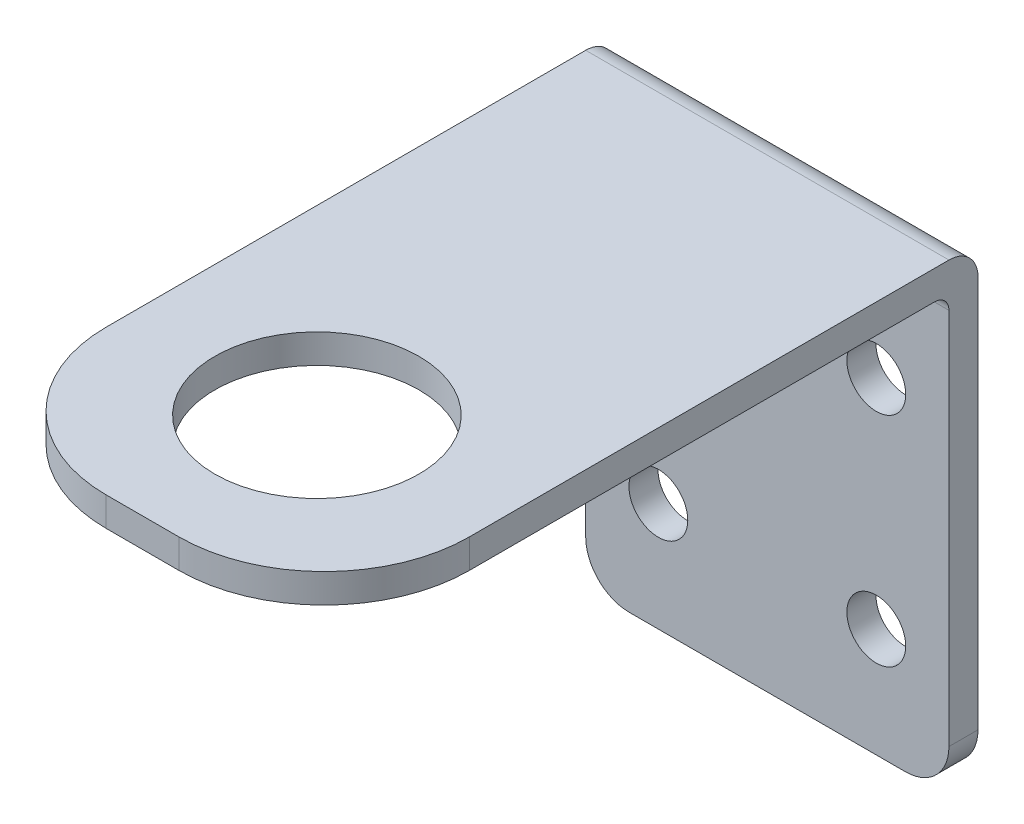
ISO-10303-21;
HEADER;
FILE_DESCRIPTION(('STEP AP214'),'2;1');
FILE_NAME('part.step','',(''),(''),'','','');
FILE_SCHEMA(('AUTOMOTIVE_DESIGN { 1 0 10303 214 1 1 1 1 }'));
ENDSEC;
DATA;
#1=APPLICATION_CONTEXT('core data for automotive mechanical design processes');
#2=APPLICATION_PROTOCOL_DEFINITION('international standard','automotive_design',2000,#1);
#3=PRODUCT_CONTEXT('',#1,'mechanical');
#4=PRODUCT('Part','Part','',(#3));
#5=PRODUCT_RELATED_PRODUCT_CATEGORY('part','',(#4));
#6=PRODUCT_DEFINITION_FORMATION('','',#4);
#7=PRODUCT_DEFINITION_CONTEXT('part definition',#1,'design');
#8=PRODUCT_DEFINITION('design','',#6,#7);
#9=PRODUCT_DEFINITION_SHAPE('','',#8);
#10=(LENGTH_UNIT() NAMED_UNIT(*) SI_UNIT(.MILLI.,.METRE.));
#11=(NAMED_UNIT(*) PLANE_ANGLE_UNIT() SI_UNIT($,.RADIAN.));
#12=(NAMED_UNIT(*) SI_UNIT($,.STERADIAN.) SOLID_ANGLE_UNIT());
#13=UNCERTAINTY_MEASURE_WITH_UNIT(LENGTH_MEASURE(1.E-05),#10,'distance_accuracy_value','');
#14=(GEOMETRIC_REPRESENTATION_CONTEXT(3) GLOBAL_UNCERTAINTY_ASSIGNED_CONTEXT((#13)) GLOBAL_UNIT_ASSIGNED_CONTEXT((#10,
#11,#12)) REPRESENTATION_CONTEXT('',''));
#15=CARTESIAN_POINT('',(0.,0.,0.));
#16=DIRECTION('',(0.,0.,1.));
#17=DIRECTION('',(1.,0.,0.));
#18=AXIS2_PLACEMENT_3D('',#15,#16,#17);
#19=CARTESIAN_POINT('',(12.5,15.,2.));
#20=DIRECTION('',(-1.,0.,0.));
#21=DIRECTION('',(0.,-1.,0.));
#22=AXIS2_PLACEMENT_3D('',#19,#20,#21);
#23=PLANE('',#22);
#24=DIRECTION('',(0.,1.,0.));
#25=VECTOR('',#24,1.);
#26=CARTESIAN_POINT('',(12.5,15.,2.));
#27=LINE('',#26,#25);
#28=CARTESIAN_POINT('',(12.5,-12.,2.));
#29=VERTEX_POINT('',#28);
#30=CARTESIAN_POINT('',(12.5,14.,2.));
#31=VERTEX_POINT('',#30);
#32=EDGE_CURVE('E243',#29,#31,#27,.T.);
#33=ORIENTED_EDGE('',*,*,#32,.F.);
#34=DIRECTION('',(0.,0.,-1.));
#35=VECTOR('',#34,1.);
#36=CARTESIAN_POINT('',(12.5,-12.,2.));
#37=LINE('',#36,#35);
#38=CARTESIAN_POINT('',(12.5,-12.,0.));
#39=VERTEX_POINT('',#38);
#40=EDGE_CURVE('E11',#29,#39,#37,.T.);
#41=ORIENTED_EDGE('',*,*,#40,.T.);
#42=DIRECTION('',(0.,1.,0.));
#43=VECTOR('',#42,1.);
#44=CARTESIAN_POINT('',(12.5,15.,0.));
#45=LINE('',#44,#43);
#46=CARTESIAN_POINT('',(12.5,15.,0.));
#47=VERTEX_POINT('',#46);
#48=EDGE_CURVE('E132',#39,#47,#45,.T.);
#49=ORIENTED_EDGE('',*,*,#48,.T.);
#50=CARTESIAN_POINT('',(12.5,15.,2.));
#51=DIRECTION('',(-1.,0.,0.));
#52=DIRECTION('',(0.,-1.,0.));
#53=AXIS2_PLACEMENT_3D('',#50,#51,#52);
#54=CIRCLE('',#53,2.);
#55=CARTESIAN_POINT('',(12.5,17.,2.00000000000002));
#56=VERTEX_POINT('',#55);
#57=EDGE_CURVE('E135',#47,#56,#54,.F.);
#58=ORIENTED_EDGE('',*,*,#57,.T.);
#59=DIRECTION('',(0.,0.,-1.));
#60=VECTOR('',#59,1.);
#61=CARTESIAN_POINT('',(12.5,17.,45.));
#62=LINE('',#61,#60);
#63=CARTESIAN_POINT('',(12.5,17.,35.));
#64=VERTEX_POINT('',#63);
#65=EDGE_CURVE('E288',#64,#56,#62,.T.);
#66=ORIENTED_EDGE('',*,*,#65,.F.);
#67=DIRECTION('',(0.,-1.,0.));
#68=VECTOR('',#67,1.);
#69=CARTESIAN_POINT('',(12.5,15.,35.));
#70=LINE('',#69,#68);
#71=CARTESIAN_POINT('',(12.5,15.,35.));
#72=VERTEX_POINT('',#71);
#73=EDGE_CURVE('E187',#64,#72,#70,.T.);
#74=ORIENTED_EDGE('',*,*,#73,.T.);
#75=DIRECTION('',(0.,0.,-1.));
#76=VECTOR('',#75,1.);
#77=CARTESIAN_POINT('',(12.5,15.,45.));
#78=LINE('',#77,#76);
#79=CARTESIAN_POINT('',(12.5,15.,3.00000000000002));
#80=VERTEX_POINT('',#79);
#81=EDGE_CURVE('E262',#72,#80,#78,.T.);
#82=ORIENTED_EDGE('',*,*,#81,.T.);
#83=CARTESIAN_POINT('',(12.5,14.,3.));
#84=DIRECTION('',(-1.,0.,0.));
#85=DIRECTION('',(0.,-1.,0.));
#86=AXIS2_PLACEMENT_3D('',#83,#84,#85);
#87=CIRCLE('',#86,1.);
#88=EDGE_CURVE('E183',#80,#31,#87,.T.);
#89=ORIENTED_EDGE('',*,*,#88,.T.);
#90=EDGE_LOOP('',(#33,#41,#49,#58,#66,#74,#82,#89));
#91=FACE_BOUND('',#90,.T.);
#92=ADVANCED_FACE('F39',(#91),#23,.F.);
#93=CARTESIAN_POINT('',(-12.5,15.,2.));
#94=DIRECTION('',(1.,0.,0.));
#95=DIRECTION('',(0.,1.,0.));
#96=AXIS2_PLACEMENT_3D('',#93,#94,#95);
#97=PLANE('',#96);
#98=DIRECTION('',(0.,-1.,0.));
#99=VECTOR('',#98,1.);
#100=CARTESIAN_POINT('',(-12.5,15.,0.));
#101=LINE('',#100,#99);
#102=CARTESIAN_POINT('',(-12.5,15.,0.));
#103=VERTEX_POINT('',#102);
#104=CARTESIAN_POINT('',(-12.5,-12.,0.));
#105=VERTEX_POINT('',#104);
#106=EDGE_CURVE('E141',#103,#105,#101,.T.);
#107=ORIENTED_EDGE('',*,*,#106,.T.);
#108=DIRECTION('',(0.,0.,-1.));
#109=VECTOR('',#108,1.);
#110=CARTESIAN_POINT('',(-12.5,-12.,2.));
#111=LINE('',#110,#109);
#112=CARTESIAN_POINT('',(-12.5,-12.,2.));
#113=VERTEX_POINT('',#112);
#114=EDGE_CURVE('E63',#105,#113,#111,.F.);
#115=ORIENTED_EDGE('',*,*,#114,.T.);
#116=DIRECTION('',(0.,-1.,0.));
#117=VECTOR('',#116,1.);
#118=CARTESIAN_POINT('',(-12.5,15.,2.));
#119=LINE('',#118,#117);
#120=CARTESIAN_POINT('',(-12.5,14.,2.));
#121=VERTEX_POINT('',#120);
#122=EDGE_CURVE('E160',#121,#113,#119,.T.);
#123=ORIENTED_EDGE('',*,*,#122,.F.);
#124=CARTESIAN_POINT('',(-12.5,14.,3.));
#125=DIRECTION('',(1.,0.,0.));
#126=DIRECTION('',(0.,1.,0.));
#127=AXIS2_PLACEMENT_3D('',#124,#125,#126);
#128=CIRCLE('',#127,1.);
#129=CARTESIAN_POINT('',(-12.5,15.,3.00000000000002));
#130=VERTEX_POINT('',#129);
#131=EDGE_CURVE('E179',#121,#130,#128,.T.);
#132=ORIENTED_EDGE('',*,*,#131,.T.);
#133=DIRECTION('',(0.,0.,-1.));
#134=VECTOR('',#133,1.);
#135=CARTESIAN_POINT('',(-12.5,15.,45.));
#136=LINE('',#135,#134);
#137=CARTESIAN_POINT('',(-12.5,15.,35.));
#138=VERTEX_POINT('',#137);
#139=EDGE_CURVE('E281',#138,#130,#136,.T.);
#140=ORIENTED_EDGE('',*,*,#139,.F.);
#141=DIRECTION('',(0.,1.,0.));
#142=VECTOR('',#141,1.);
#143=CARTESIAN_POINT('',(-12.5,17.,35.));
#144=LINE('',#143,#142);
#145=CARTESIAN_POINT('',(-12.5,17.,35.));
#146=VERTEX_POINT('',#145);
#147=EDGE_CURVE('E209',#138,#146,#144,.T.);
#148=ORIENTED_EDGE('',*,*,#147,.T.);
#149=DIRECTION('',(0.,0.,-1.));
#150=VECTOR('',#149,1.);
#151=CARTESIAN_POINT('',(-12.5,17.,45.));
#152=LINE('',#151,#150);
#153=CARTESIAN_POINT('',(-12.5,17.,2.00000000000002));
#154=VERTEX_POINT('',#153);
#155=EDGE_CURVE('E284',#146,#154,#152,.T.);
#156=ORIENTED_EDGE('',*,*,#155,.T.);
#157=CARTESIAN_POINT('',(-12.5,15.,2.));
#158=DIRECTION('',(1.,0.,0.));
#159=DIRECTION('',(0.,1.,0.));
#160=AXIS2_PLACEMENT_3D('',#157,#158,#159);
#161=CIRCLE('',#160,2.);
#162=EDGE_CURVE('E168',#154,#103,#161,.F.);
#163=ORIENTED_EDGE('',*,*,#162,.T.);
#164=EDGE_LOOP('',(#107,#115,#123,#132,#140,#148,#156,#163));
#165=FACE_BOUND('',#164,.T.);
#166=ADVANCED_FACE('F240',(#165),#97,.F.);
#167=CARTESIAN_POINT('',(-12.5,-15.,2.));
#168=DIRECTION('',(0.,1.,0.));
#169=DIRECTION('',(0.,0.,1.));
#170=AXIS2_PLACEMENT_3D('',#167,#168,#169);
#171=PLANE('',#170);
#172=DIRECTION('',(1.,0.,0.));
#173=VECTOR('',#172,1.);
#174=CARTESIAN_POINT('',(-12.5,-15.,2.));
#175=LINE('',#174,#173);
#176=CARTESIAN_POINT('',(-9.5,-15.,2.));
#177=VERTEX_POINT('',#176);
#178=CARTESIAN_POINT('',(9.5,-15.,2.));
#179=VERTEX_POINT('',#178);
#180=EDGE_CURVE('E157',#177,#179,#175,.T.);
#181=ORIENTED_EDGE('',*,*,#180,.F.);
#182=DIRECTION('',(0.,0.,-1.));
#183=VECTOR('',#182,1.);
#184=CARTESIAN_POINT('',(-9.5,-15.,2.));
#185=LINE('',#184,#183);
#186=CARTESIAN_POINT('',(-9.5,-15.,0.));
#187=VERTEX_POINT('',#186);
#188=EDGE_CURVE('E216',#177,#187,#185,.T.);
#189=ORIENTED_EDGE('',*,*,#188,.T.);
#190=DIRECTION('',(1.,0.,0.));
#191=VECTOR('',#190,1.);
#192=CARTESIAN_POINT('',(-12.5,-15.,0.));
#193=LINE('',#192,#191);
#194=CARTESIAN_POINT('',(9.5,-15.,0.));
#195=VERTEX_POINT('',#194);
#196=EDGE_CURVE('E163',#187,#195,#193,.T.);
#197=ORIENTED_EDGE('',*,*,#196,.T.);
#198=DIRECTION('',(0.,0.,-1.));
#199=VECTOR('',#198,1.);
#200=CARTESIAN_POINT('',(9.5,-15.,2.));
#201=LINE('',#200,#199);
#202=EDGE_CURVE('E213',#195,#179,#201,.F.);
#203=ORIENTED_EDGE('',*,*,#202,.T.);
#204=EDGE_LOOP('',(#181,#189,#197,#203));
#205=FACE_BOUND('',#204,.T.);
#206=ADVANCED_FACE('F236',(#205),#171,.F.);
#207=CARTESIAN_POINT('',(0.,0.,2.));
#208=DIRECTION('',(0.,0.,1.));
#209=DIRECTION('',(1.,0.,0.));
#210=AXIS2_PLACEMENT_3D('',#207,#208,#209);
#211=PLANE('',#210);
#212=CARTESIAN_POINT('',(-7.5,-7.5,2.));
#213=DIRECTION('',(0.,0.,1.));
#214=DIRECTION('',(1.,0.,0.));
#215=AXIS2_PLACEMENT_3D('',#212,#213,#214);
#216=CIRCLE('',#215,2.025);
#217=CARTESIAN_POINT('',(-5.475,-7.5,2.));
#218=VERTEX_POINT('',#217);
#219=EDGE_CURVE('E257',#218,#218,#216,.T.);
#220=ORIENTED_EDGE('',*,*,#219,.F.);
#221=EDGE_LOOP('',(#220));
#222=FACE_BOUND('',#221,.T.);
#223=CARTESIAN_POINT('',(7.5,-7.5,2.));
#224=DIRECTION('',(0.,0.,1.));
#225=DIRECTION('',(1.,0.,0.));
#226=AXIS2_PLACEMENT_3D('',#223,#224,#225);
#227=CIRCLE('',#226,2.025);
#228=CARTESIAN_POINT('',(9.52500000000001,-7.5,2.));
#229=VERTEX_POINT('',#228);
#230=EDGE_CURVE('E266',#229,#229,#227,.T.);
#231=ORIENTED_EDGE('',*,*,#230,.F.);
#232=EDGE_LOOP('',(#231));
#233=FACE_BOUND('',#232,.T.);
#234=CARTESIAN_POINT('',(7.5,7.5,2.));
#235=DIRECTION('',(0.,0.,1.));
#236=DIRECTION('',(1.,0.,0.));
#237=AXIS2_PLACEMENT_3D('',#234,#235,#236);
#238=CIRCLE('',#237,2.025);
#239=CARTESIAN_POINT('',(9.525,7.5,2.));
#240=VERTEX_POINT('',#239);
#241=EDGE_CURVE('E274',#240,#240,#238,.T.);
#242=ORIENTED_EDGE('',*,*,#241,.F.);
#243=EDGE_LOOP('',(#242));
#244=FACE_BOUND('',#243,.T.);
#245=CARTESIAN_POINT('',(-7.5,7.5,2.));
#246=DIRECTION('',(0.,0.,1.));
#247=DIRECTION('',(1.,0.,0.));
#248=AXIS2_PLACEMENT_3D('',#245,#246,#247);
#249=CIRCLE('',#248,2.025);
#250=CARTESIAN_POINT('',(-5.475,7.5,2.));
#251=VERTEX_POINT('',#250);
#252=EDGE_CURVE('E249',#251,#251,#249,.T.);
#253=ORIENTED_EDGE('',*,*,#252,.F.);
#254=EDGE_LOOP('',(#253));
#255=FACE_BOUND('',#254,.T.);
#256=ORIENTED_EDGE('',*,*,#122,.T.);
#257=CARTESIAN_POINT('',(-9.5,-12.,2.));
#258=DIRECTION('',(0.,0.,1.));
#259=DIRECTION('',(1.,0.,0.));
#260=AXIS2_PLACEMENT_3D('',#257,#258,#259);
#261=CIRCLE('',#260,3.);
#262=EDGE_CURVE('E48',#113,#177,#261,.T.);
#263=ORIENTED_EDGE('',*,*,#262,.T.);
#264=ORIENTED_EDGE('',*,*,#180,.T.);
#265=CARTESIAN_POINT('',(9.5,-12.,2.));
#266=DIRECTION('',(0.,0.,1.));
#267=DIRECTION('',(1.,0.,0.));
#268=AXIS2_PLACEMENT_3D('',#265,#266,#267);
#269=CIRCLE('',#268,3.);
#270=EDGE_CURVE('E55',#179,#29,#269,.T.);
#271=ORIENTED_EDGE('',*,*,#270,.T.);
#272=ORIENTED_EDGE('',*,*,#32,.T.);
#273=DIRECTION('',(-1.,0.,0.));
#274=VECTOR('',#273,1.);
#275=CARTESIAN_POINT('',(-12.5,14.,2.));
#276=LINE('',#275,#274);
#277=EDGE_CURVE('E171',#31,#121,#276,.T.);
#278=ORIENTED_EDGE('',*,*,#277,.T.);
#279=EDGE_LOOP('',(#256,#263,#264,#271,#272,#278));
#280=FACE_BOUND('',#279,.T.);
#281=ADVANCED_FACE('F232',(#222,#233,#244,#255,#280),#211,.T.);
#282=CARTESIAN_POINT('',(0.,0.,0.));
#283=DIRECTION('',(0.,0.,1.));
#284=DIRECTION('',(1.,0.,0.));
#285=AXIS2_PLACEMENT_3D('',#282,#283,#284);
#286=PLANE('',#285);
#287=CARTESIAN_POINT('',(-7.5,-7.5,0.));
#288=DIRECTION('',(0.,0.,1.));
#289=DIRECTION('',(1.,0.,0.));
#290=AXIS2_PLACEMENT_3D('',#287,#288,#289);
#291=CIRCLE('',#290,2.025);
#292=CARTESIAN_POINT('',(-5.475,-7.5,0.));
#293=VERTEX_POINT('',#292);
#294=EDGE_CURVE('E261',#293,#293,#291,.T.);
#295=ORIENTED_EDGE('',*,*,#294,.T.);
#296=EDGE_LOOP('',(#295));
#297=FACE_BOUND('',#296,.T.);
#298=CARTESIAN_POINT('',(7.5,-7.5,0.));
#299=DIRECTION('',(0.,0.,1.));
#300=DIRECTION('',(1.,0.,0.));
#301=AXIS2_PLACEMENT_3D('',#298,#299,#300);
#302=CIRCLE('',#301,2.025);
#303=CARTESIAN_POINT('',(9.52500000000001,-7.5,0.));
#304=VERTEX_POINT('',#303);
#305=EDGE_CURVE('E270',#304,#304,#302,.T.);
#306=ORIENTED_EDGE('',*,*,#305,.T.);
#307=EDGE_LOOP('',(#306));
#308=FACE_BOUND('',#307,.T.);
#309=CARTESIAN_POINT('',(7.5,7.5,0.));
#310=DIRECTION('',(0.,0.,1.));
#311=DIRECTION('',(1.,0.,0.));
#312=AXIS2_PLACEMENT_3D('',#309,#310,#311);
#313=CIRCLE('',#312,2.025);
#314=CARTESIAN_POINT('',(9.525,7.5,0.));
#315=VERTEX_POINT('',#314);
#316=EDGE_CURVE('E253',#315,#315,#313,.T.);
#317=ORIENTED_EDGE('',*,*,#316,.T.);
#318=EDGE_LOOP('',(#317));
#319=FACE_BOUND('',#318,.T.);
#320=CARTESIAN_POINT('',(-7.5,7.5,0.));
#321=DIRECTION('',(0.,0.,1.));
#322=DIRECTION('',(1.,0.,0.));
#323=AXIS2_PLACEMENT_3D('',#320,#321,#322);
#324=CIRCLE('',#323,2.025);
#325=CARTESIAN_POINT('',(-5.475,7.5,0.));
#326=VERTEX_POINT('',#325);
#327=EDGE_CURVE('E142',#326,#326,#324,.T.);
#328=ORIENTED_EDGE('',*,*,#327,.T.);
#329=EDGE_LOOP('',(#328));
#330=FACE_BOUND('',#329,.T.);
#331=ORIENTED_EDGE('',*,*,#196,.F.);
#332=CARTESIAN_POINT('',(-9.5,-12.,0.));
#333=DIRECTION('',(0.,0.,1.));
#334=DIRECTION('',(1.,0.,0.));
#335=AXIS2_PLACEMENT_3D('',#332,#333,#334);
#336=CIRCLE('',#335,3.);
#337=EDGE_CURVE('E223',#187,#105,#336,.F.);
#338=ORIENTED_EDGE('',*,*,#337,.T.);
#339=ORIENTED_EDGE('',*,*,#106,.F.);
#340=DIRECTION('',(1.,0.,0.));
#341=VECTOR('',#340,1.);
#342=CARTESIAN_POINT('',(12.5,15.,0.));
#343=LINE('',#342,#341);
#344=EDGE_CURVE('E148',#103,#47,#343,.T.);
#345=ORIENTED_EDGE('',*,*,#344,.T.);
#346=ORIENTED_EDGE('',*,*,#48,.F.);
#347=CARTESIAN_POINT('',(9.5,-12.,0.));
#348=DIRECTION('',(0.,0.,1.));
#349=DIRECTION('',(1.,0.,0.));
#350=AXIS2_PLACEMENT_3D('',#347,#348,#349);
#351=CIRCLE('',#350,3.);
#352=EDGE_CURVE('E220',#39,#195,#351,.F.);
#353=ORIENTED_EDGE('',*,*,#352,.T.);
#354=EDGE_LOOP('',(#331,#338,#339,#345,#346,#353));
#355=FACE_BOUND('',#354,.T.);
#356=ADVANCED_FACE('F155',(#297,#308,#319,#330,#355),#286,.F.);
#357=CARTESIAN_POINT('',(-7.5,7.5,0.));
#358=DIRECTION('',(0.,0.,1.));
#359=DIRECTION('',(1.,0.,0.));
#360=AXIS2_PLACEMENT_3D('',#357,#358,#359);
#361=CYLINDRICAL_SURFACE('',#360,2.025);
#362=ORIENTED_EDGE('',*,*,#327,.F.);
#363=EDGE_LOOP('',(#362));
#364=FACE_BOUND('',#363,.T.);
#365=ORIENTED_EDGE('',*,*,#252,.T.);
#366=EDGE_LOOP('',(#365));
#367=FACE_BOUND('',#366,.T.);
#368=ADVANCED_FACE('F375',(#364,#367),#361,.F.);
#369=CARTESIAN_POINT('',(7.5,7.5,0.));
#370=DIRECTION('',(0.,0.,1.));
#371=DIRECTION('',(1.,0.,0.));
#372=AXIS2_PLACEMENT_3D('',#369,#370,#371);
#373=CYLINDRICAL_SURFACE('',#372,2.025);
#374=ORIENTED_EDGE('',*,*,#316,.F.);
#375=EDGE_LOOP('',(#374));
#376=FACE_BOUND('',#375,.T.);
#377=ORIENTED_EDGE('',*,*,#241,.T.);
#378=EDGE_LOOP('',(#377));
#379=FACE_BOUND('',#378,.T.);
#380=ADVANCED_FACE('F371',(#376,#379),#373,.F.);
#381=CARTESIAN_POINT('',(7.5,-7.5,0.));
#382=DIRECTION('',(0.,0.,1.));
#383=DIRECTION('',(1.,0.,0.));
#384=AXIS2_PLACEMENT_3D('',#381,#382,#383);
#385=CYLINDRICAL_SURFACE('',#384,2.025);
#386=ORIENTED_EDGE('',*,*,#305,.F.);
#387=EDGE_LOOP('',(#386));
#388=FACE_BOUND('',#387,.T.);
#389=ORIENTED_EDGE('',*,*,#230,.T.);
#390=EDGE_LOOP('',(#389));
#391=FACE_BOUND('',#390,.T.);
#392=ADVANCED_FACE('F374',(#388,#391),#385,.F.);
#393=CARTESIAN_POINT('',(-7.5,-7.5,0.));
#394=DIRECTION('',(0.,0.,1.));
#395=DIRECTION('',(1.,0.,0.));
#396=AXIS2_PLACEMENT_3D('',#393,#394,#395);
#397=CYLINDRICAL_SURFACE('',#396,2.025);
#398=ORIENTED_EDGE('',*,*,#294,.F.);
#399=EDGE_LOOP('',(#398));
#400=FACE_BOUND('',#399,.T.);
#401=ORIENTED_EDGE('',*,*,#219,.T.);
#402=EDGE_LOOP('',(#401));
#403=FACE_BOUND('',#402,.T.);
#404=ADVANCED_FACE('F369',(#400,#403),#397,.F.);
#405=CARTESIAN_POINT('',(-12.5,15.,45.));
#406=DIRECTION('',(0.,-1.,0.));
#407=DIRECTION('',(0.,0.,-1.));
#408=AXIS2_PLACEMENT_3D('',#405,#406,#407);
#409=PLANE('',#408);
#410=CARTESIAN_POINT('',(0.,15.,33.));
#411=DIRECTION('',(0.,-1.,0.));
#412=DIRECTION('',(0.,0.,-1.));
#413=AXIS2_PLACEMENT_3D('',#410,#411,#412);
#414=CIRCLE('',#413,7.025);
#415=CARTESIAN_POINT('',(0.,15.,25.975));
#416=VERTEX_POINT('',#415);
#417=EDGE_CURVE('E300',#416,#416,#414,.T.);
#418=ORIENTED_EDGE('',*,*,#417,.F.);
#419=EDGE_LOOP('',(#418));
#420=FACE_BOUND('',#419,.T.);
#421=ORIENTED_EDGE('',*,*,#81,.F.);
#422=CARTESIAN_POINT('',(2.5,15.,35.));
#423=DIRECTION('',(0.,-1.,0.));
#424=DIRECTION('',(0.,0.,-1.));
#425=AXIS2_PLACEMENT_3D('',#422,#423,#424);
#426=CIRCLE('',#425,10.);
#427=CARTESIAN_POINT('',(2.5,15.,45.));
#428=VERTEX_POINT('',#427);
#429=EDGE_CURVE('E194',#72,#428,#426,.T.);
#430=ORIENTED_EDGE('',*,*,#429,.T.);
#431=DIRECTION('',(-1.,0.,0.));
#432=VECTOR('',#431,1.);
#433=CARTESIAN_POINT('',(-12.5,15.,45.));
#434=LINE('',#433,#432);
#435=CARTESIAN_POINT('',(-2.50000000000001,15.,45.));
#436=VERTEX_POINT('',#435);
#437=EDGE_CURVE('E296',#428,#436,#434,.T.);
#438=ORIENTED_EDGE('',*,*,#437,.T.);
#439=CARTESIAN_POINT('',(-2.50000000000001,15.,35.));
#440=DIRECTION('',(0.,-1.,0.));
#441=DIRECTION('',(0.,0.,-1.));
#442=AXIS2_PLACEMENT_3D('',#439,#440,#441);
#443=CIRCLE('',#442,10.);
#444=EDGE_CURVE('E191',#436,#138,#443,.T.);
#445=ORIENTED_EDGE('',*,*,#444,.T.);
#446=ORIENTED_EDGE('',*,*,#139,.T.);
#447=DIRECTION('',(-1.,0.,0.));
#448=VECTOR('',#447,1.);
#449=CARTESIAN_POINT('',(12.5,15.,3.));
#450=LINE('',#449,#448);
#451=EDGE_CURVE('E175',#130,#80,#450,.F.);
#452=ORIENTED_EDGE('',*,*,#451,.T.);
#453=EDGE_LOOP('',(#421,#430,#438,#445,#446,#452));
#454=FACE_BOUND('',#453,.T.);
#455=ADVANCED_FACE('F315',(#420,#454),#409,.T.);
#456=CARTESIAN_POINT('',(12.5,17.,45.));
#457=DIRECTION('',(0.,1.,0.));
#458=DIRECTION('',(0.,0.,1.));
#459=AXIS2_PLACEMENT_3D('',#456,#457,#458);
#460=PLANE('',#459);
#461=CARTESIAN_POINT('',(0.,17.,33.));
#462=DIRECTION('',(0.,1.,0.));
#463=DIRECTION('',(0.,0.,1.));
#464=AXIS2_PLACEMENT_3D('',#461,#462,#463);
#465=CIRCLE('',#464,7.025);
#466=CARTESIAN_POINT('',(0.,17.,40.025));
#467=VERTEX_POINT('',#466);
#468=EDGE_CURVE('E304',#467,#467,#465,.T.);
#469=ORIENTED_EDGE('',*,*,#468,.F.);
#470=EDGE_LOOP('',(#469));
#471=FACE_BOUND('',#470,.T.);
#472=DIRECTION('',(1.,0.,0.));
#473=VECTOR('',#472,1.);
#474=CARTESIAN_POINT('',(12.5,17.,45.));
#475=LINE('',#474,#473);
#476=CARTESIAN_POINT('',(-2.50000000000001,17.,45.));
#477=VERTEX_POINT('',#476);
#478=CARTESIAN_POINT('',(2.5,17.,45.));
#479=VERTEX_POINT('',#478);
#480=EDGE_CURVE('E285',#477,#479,#475,.T.);
#481=ORIENTED_EDGE('',*,*,#480,.T.);
#482=CARTESIAN_POINT('',(2.49999999999999,17.,35.));
#483=DIRECTION('',(0.,1.,0.));
#484=DIRECTION('',(0.,0.,1.));
#485=AXIS2_PLACEMENT_3D('',#482,#483,#484);
#486=CIRCLE('',#485,10.);
#487=EDGE_CURVE('E206',#479,#64,#486,.T.);
#488=ORIENTED_EDGE('',*,*,#487,.T.);
#489=ORIENTED_EDGE('',*,*,#65,.T.);
#490=DIRECTION('',(1.,0.,0.));
#491=VECTOR('',#490,1.);
#492=CARTESIAN_POINT('',(-12.5,17.,2.));
#493=LINE('',#492,#491);
#494=EDGE_CURVE('E150',#56,#154,#493,.F.);
#495=ORIENTED_EDGE('',*,*,#494,.T.);
#496=ORIENTED_EDGE('',*,*,#155,.F.);
#497=CARTESIAN_POINT('',(-2.50000000000001,17.,35.));
#498=DIRECTION('',(0.,1.,0.));
#499=DIRECTION('',(0.,0.,1.));
#500=AXIS2_PLACEMENT_3D('',#497,#498,#499);
#501=CIRCLE('',#500,10.);
#502=EDGE_CURVE('E203',#146,#477,#501,.T.);
#503=ORIENTED_EDGE('',*,*,#502,.T.);
#504=EDGE_LOOP('',(#481,#488,#489,#495,#496,#503));
#505=FACE_BOUND('',#504,.T.);
#506=ADVANCED_FACE('F311',(#471,#505),#460,.T.);
#507=CARTESIAN_POINT('',(0.,0.,45.));
#508=DIRECTION('',(0.,0.,1.));
#509=DIRECTION('',(1.,0.,0.));
#510=AXIS2_PLACEMENT_3D('',#507,#508,#509);
#511=PLANE('',#510);
#512=ORIENTED_EDGE('',*,*,#437,.F.);
#513=DIRECTION('',(0.,-1.,0.));
#514=VECTOR('',#513,1.);
#515=CARTESIAN_POINT('',(2.49999999999999,17.,45.));
#516=LINE('',#515,#514);
#517=EDGE_CURVE('E200',#428,#479,#516,.F.);
#518=ORIENTED_EDGE('',*,*,#517,.T.);
#519=ORIENTED_EDGE('',*,*,#480,.F.);
#520=DIRECTION('',(0.,1.,0.));
#521=VECTOR('',#520,1.);
#522=CARTESIAN_POINT('',(-2.50000000000001,15.,45.));
#523=LINE('',#522,#521);
#524=EDGE_CURVE('E197',#477,#436,#523,.F.);
#525=ORIENTED_EDGE('',*,*,#524,.T.);
#526=EDGE_LOOP('',(#512,#518,#519,#525));
#527=FACE_BOUND('',#526,.T.);
#528=ADVANCED_FACE('F314',(#527),#511,.T.);
#529=CARTESIAN_POINT('',(0.,15.,2.));
#530=DIRECTION('',(-1.,0.,0.));
#531=DIRECTION('',(0.,0.,1.));
#532=AXIS2_PLACEMENT_3D('',#529,#530,#531);
#533=CYLINDRICAL_SURFACE('',#532,2.);
#534=ORIENTED_EDGE('',*,*,#162,.F.);
#535=ORIENTED_EDGE('',*,*,#494,.F.);
#536=ORIENTED_EDGE('',*,*,#57,.F.);
#537=ORIENTED_EDGE('',*,*,#344,.F.);
#538=EDGE_LOOP('',(#534,#535,#536,#537));
#539=FACE_BOUND('',#538,.T.);
#540=ADVANCED_FACE('F147',(#539),#533,.T.);
#541=CARTESIAN_POINT('',(0.,14.,3.));
#542=DIRECTION('',(1.,0.,0.));
#543=DIRECTION('',(0.,0.,-1.));
#544=AXIS2_PLACEMENT_3D('',#541,#542,#543);
#545=CYLINDRICAL_SURFACE('',#544,1.);
#546=ORIENTED_EDGE('',*,*,#88,.F.);
#547=ORIENTED_EDGE('',*,*,#451,.F.);
#548=ORIENTED_EDGE('',*,*,#131,.F.);
#549=ORIENTED_EDGE('',*,*,#277,.F.);
#550=EDGE_LOOP('',(#546,#547,#548,#549));
#551=FACE_BOUND('',#550,.T.);
#552=ADVANCED_FACE('F334',(#551),#545,.F.);
#553=CARTESIAN_POINT('',(0.,-15.,33.));
#554=DIRECTION('',(0.,1.,0.));
#555=DIRECTION('',(0.,0.,1.));
#556=AXIS2_PLACEMENT_3D('',#553,#554,#555);
#557=CYLINDRICAL_SURFACE('',#556,7.025);
#558=ORIENTED_EDGE('',*,*,#417,.T.);
#559=EDGE_LOOP('',(#558));
#560=FACE_BOUND('',#559,.T.);
#561=ORIENTED_EDGE('',*,*,#468,.T.);
#562=EDGE_LOOP('',(#561));
#563=FACE_BOUND('',#562,.T.);
#564=ADVANCED_FACE('F309',(#560,#563),#557,.F.);
#565=CARTESIAN_POINT('',(2.5,15.,35.));
#566=DIRECTION('',(0.,1.,0.));
#567=DIRECTION('',(-1.,0.,0.));
#568=AXIS2_PLACEMENT_3D('',#565,#566,#567);
#569=CYLINDRICAL_SURFACE('',#568,10.);
#570=ORIENTED_EDGE('',*,*,#487,.F.);
#571=ORIENTED_EDGE('',*,*,#517,.F.);
#572=ORIENTED_EDGE('',*,*,#429,.F.);
#573=ORIENTED_EDGE('',*,*,#73,.F.);
#574=EDGE_LOOP('',(#570,#571,#572,#573));
#575=FACE_BOUND('',#574,.T.);
#576=ADVANCED_FACE('F325',(#575),#569,.T.);
#577=CARTESIAN_POINT('',(-2.50000000000001,15.,35.));
#578=DIRECTION('',(0.,-1.,0.));
#579=DIRECTION('',(1.,0.,0.));
#580=AXIS2_PLACEMENT_3D('',#577,#578,#579);
#581=CYLINDRICAL_SURFACE('',#580,10.);
#582=ORIENTED_EDGE('',*,*,#444,.F.);
#583=ORIENTED_EDGE('',*,*,#524,.F.);
#584=ORIENTED_EDGE('',*,*,#502,.F.);
#585=ORIENTED_EDGE('',*,*,#147,.F.);
#586=EDGE_LOOP('',(#582,#583,#584,#585));
#587=FACE_BOUND('',#586,.T.);
#588=ADVANCED_FACE('F340',(#587),#581,.T.);
#589=CARTESIAN_POINT('',(-9.5,-12.,2.));
#590=DIRECTION('',(0.,0.,-1.));
#591=DIRECTION('',(-1.,0.,0.));
#592=AXIS2_PLACEMENT_3D('',#589,#590,#591);
#593=CYLINDRICAL_SURFACE('',#592,3.);
#594=ORIENTED_EDGE('',*,*,#262,.F.);
#595=ORIENTED_EDGE('',*,*,#114,.F.);
#596=ORIENTED_EDGE('',*,*,#337,.F.);
#597=ORIENTED_EDGE('',*,*,#188,.F.);
#598=EDGE_LOOP('',(#594,#595,#596,#597));
#599=FACE_BOUND('',#598,.T.);
#600=ADVANCED_FACE('F239',(#599),#593,.T.);
#601=CARTESIAN_POINT('',(9.5,-12.,2.));
#602=DIRECTION('',(0.,0.,-1.));
#603=DIRECTION('',(-1.,0.,0.));
#604=AXIS2_PLACEMENT_3D('',#601,#602,#603);
#605=CYLINDRICAL_SURFACE('',#604,3.);
#606=ORIENTED_EDGE('',*,*,#270,.F.);
#607=ORIENTED_EDGE('',*,*,#202,.F.);
#608=ORIENTED_EDGE('',*,*,#352,.F.);
#609=ORIENTED_EDGE('',*,*,#40,.F.);
#610=EDGE_LOOP('',(#606,#607,#608,#609));
#611=FACE_BOUND('',#610,.T.);
#612=ADVANCED_FACE('F41',(#611),#605,.T.);
#613=CLOSED_SHELL('',(#92,#166,#206,#281,#356,#368,#380,#392,#404,#455,#506,#528,#540,#552,#564,
#576,#588,#600,#612));
#614=MANIFOLD_SOLID_BREP('B2',#613);
#615=ADVANCED_BREP_SHAPE_REPRESENTATION('',(#18,#614),#14);
#616=SHAPE_DEFINITION_REPRESENTATION(#9,#615);
ENDSEC;
END-ISO-10303-21;
